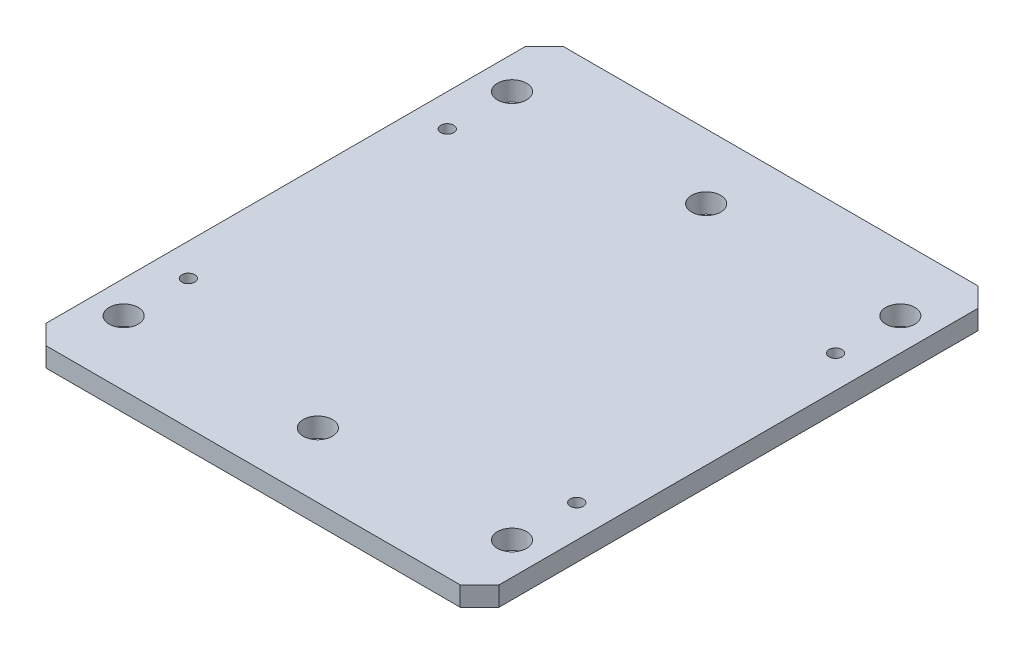
ISO-10303-21;
HEADER;
FILE_DESCRIPTION(('STEP AP214'),'2;1');
FILE_NAME('part.step','',(''),(''),'','','');
FILE_SCHEMA(('AUTOMOTIVE_DESIGN { 1 0 10303 214 1 1 1 1 }'));
ENDSEC;
DATA;
#1=APPLICATION_CONTEXT('core data for automotive mechanical design processes');
#2=APPLICATION_PROTOCOL_DEFINITION('international standard','automotive_design',2000,#1);
#3=PRODUCT_CONTEXT('',#1,'mechanical');
#4=PRODUCT('Part','Part','',(#3));
#5=PRODUCT_RELATED_PRODUCT_CATEGORY('part','',(#4));
#6=PRODUCT_DEFINITION_FORMATION('','',#4);
#7=PRODUCT_DEFINITION_CONTEXT('part definition',#1,'design');
#8=PRODUCT_DEFINITION('design','',#6,#7);
#9=PRODUCT_DEFINITION_SHAPE('','',#8);
#10=(LENGTH_UNIT() NAMED_UNIT(*) SI_UNIT(.MILLI.,.METRE.));
#11=(NAMED_UNIT(*) PLANE_ANGLE_UNIT() SI_UNIT($,.RADIAN.));
#12=(NAMED_UNIT(*) SI_UNIT($,.STERADIAN.) SOLID_ANGLE_UNIT());
#13=UNCERTAINTY_MEASURE_WITH_UNIT(LENGTH_MEASURE(1.E-05),#10,'distance_accuracy_value','');
#14=(GEOMETRIC_REPRESENTATION_CONTEXT(3) GLOBAL_UNCERTAINTY_ASSIGNED_CONTEXT((#13)) GLOBAL_UNIT_ASSIGNED_CONTEXT((#10,
#11,#12)) REPRESENTATION_CONTEXT('',''));
#15=CARTESIAN_POINT('',(0.,0.,0.));
#16=DIRECTION('',(0.,0.,1.));
#17=DIRECTION('',(1.,0.,0.));
#18=AXIS2_PLACEMENT_3D('',#15,#16,#17);
#19=CARTESIAN_POINT('',(0.,0.,80.));
#20=DIRECTION('',(1.,0.,0.));
#21=DIRECTION('',(0.,0.,-1.));
#22=AXIS2_PLACEMENT_3D('',#19,#20,#21);
#23=PLANE('',#22);
#24=DIRECTION('',(0.,1.,0.));
#25=VECTOR('',#24,1.);
#26=CARTESIAN_POINT('',(0.,0.,77.));
#27=LINE('',#26,#25);
#28=CARTESIAN_POINT('',(0.,0.,77.));
#29=VERTEX_POINT('',#28);
#30=CARTESIAN_POINT('',(0.,3.,77.));
#31=VERTEX_POINT('',#30);
#32=EDGE_CURVE('E137',#29,#31,#27,.T.);
#33=ORIENTED_EDGE('',*,*,#32,.T.);
#34=DIRECTION('',(0.,0.,1.));
#35=VECTOR('',#34,1.);
#36=CARTESIAN_POINT('',(0.,3.,0.));
#37=LINE('',#36,#35);
#38=CARTESIAN_POINT('',(0.,3.,3.));
#39=VERTEX_POINT('',#38);
#40=EDGE_CURVE('E48',#39,#31,#37,.T.);
#41=ORIENTED_EDGE('',*,*,#40,.F.);
#42=DIRECTION('',(0.,-1.,0.));
#43=VECTOR('',#42,1.);
#44=CARTESIAN_POINT('',(0.,0.,3.));
#45=LINE('',#44,#43);
#46=CARTESIAN_POINT('',(0.,0.,3.));
#47=VERTEX_POINT('',#46);
#48=EDGE_CURVE('E135',#39,#47,#45,.T.);
#49=ORIENTED_EDGE('',*,*,#48,.T.);
#50=DIRECTION('',(0.,0.,-1.));
#51=VECTOR('',#50,1.);
#52=CARTESIAN_POINT('',(0.,0.,80.));
#53=LINE('',#52,#51);
#54=EDGE_CURVE('E139',#29,#47,#53,.T.);
#55=ORIENTED_EDGE('',*,*,#54,.F.);
#56=EDGE_LOOP('',(#33,#41,#49,#55));
#57=FACE_BOUND('',#56,.T.);
#58=ADVANCED_FACE('F32',(#57),#23,.F.);
#59=CARTESIAN_POINT('',(0.,0.,80.));
#60=DIRECTION('',(0.,1.,0.));
#61=DIRECTION('',(0.,0.,1.));
#62=AXIS2_PLACEMENT_3D('',#59,#60,#61);
#63=PLANE('',#62);
#64=CARTESIAN_POINT('',(65.,0.,20.));
#65=DIRECTION('',(0.,1.,0.));
#66=DIRECTION('',(0.,0.,-1.));
#67=AXIS2_PLACEMENT_3D('',#64,#65,#66);
#68=CIRCLE('',#67,0.999999999999998);
#69=CARTESIAN_POINT('',(65.,0.,19.));
#70=VERTEX_POINT('',#69);
#71=EDGE_CURVE('E177',#70,#70,#68,.T.);
#72=ORIENTED_EDGE('',*,*,#71,.T.);
#73=EDGE_LOOP('',(#72));
#74=FACE_BOUND('',#73,.T.);
#75=CARTESIAN_POINT('',(65.,0.,60.));
#76=DIRECTION('',(0.,1.,0.));
#77=DIRECTION('',(0.,0.,1.));
#78=AXIS2_PLACEMENT_3D('',#75,#76,#77);
#79=CIRCLE('',#78,0.999999999999998);
#80=CARTESIAN_POINT('',(65.,0.,61.));
#81=VERTEX_POINT('',#80);
#82=EDGE_CURVE('E174',#81,#81,#79,.T.);
#83=ORIENTED_EDGE('',*,*,#82,.T.);
#84=EDGE_LOOP('',(#83));
#85=FACE_BOUND('',#84,.T.);
#86=CARTESIAN_POINT('',(5.,0.,60.));
#87=DIRECTION('',(0.,1.,0.));
#88=DIRECTION('',(0.,0.,-1.));
#89=AXIS2_PLACEMENT_3D('',#86,#87,#88);
#90=CIRCLE('',#89,1.);
#91=CARTESIAN_POINT('',(5.,0.,59.));
#92=VERTEX_POINT('',#91);
#93=EDGE_CURVE('E171',#92,#92,#90,.T.);
#94=ORIENTED_EDGE('',*,*,#93,.T.);
#95=EDGE_LOOP('',(#94));
#96=FACE_BOUND('',#95,.T.);
#97=CARTESIAN_POINT('',(5.,0.,20.));
#98=DIRECTION('',(0.,1.,0.));
#99=DIRECTION('',(0.,0.,1.));
#100=AXIS2_PLACEMENT_3D('',#97,#98,#99);
#101=CIRCLE('',#100,1.);
#102=CARTESIAN_POINT('',(5.,0.,21.));
#103=VERTEX_POINT('',#102);
#104=EDGE_CURVE('E168',#103,#103,#101,.T.);
#105=ORIENTED_EDGE('',*,*,#104,.T.);
#106=EDGE_LOOP('',(#105));
#107=FACE_BOUND('',#106,.T.);
#108=CARTESIAN_POINT('',(35.,0.,70.));
#109=DIRECTION('',(0.,1.,0.));
#110=DIRECTION('',(0.,0.,1.));
#111=AXIS2_PLACEMENT_3D('',#108,#109,#110);
#112=CIRCLE('',#111,2.25);
#113=CARTESIAN_POINT('',(35.,0.,72.25));
#114=VERTEX_POINT('',#113);
#115=EDGE_CURVE('E165',#114,#114,#112,.T.);
#116=ORIENTED_EDGE('',*,*,#115,.T.);
#117=EDGE_LOOP('',(#116));
#118=FACE_BOUND('',#117,.T.);
#119=CARTESIAN_POINT('',(35.,0.,10.));
#120=DIRECTION('',(0.,1.,0.));
#121=DIRECTION('',(0.,0.,1.));
#122=AXIS2_PLACEMENT_3D('',#119,#120,#121);
#123=CIRCLE('',#122,2.25);
#124=CARTESIAN_POINT('',(35.,0.,12.25));
#125=VERTEX_POINT('',#124);
#126=EDGE_CURVE('E162',#125,#125,#123,.T.);
#127=ORIENTED_EDGE('',*,*,#126,.T.);
#128=EDGE_LOOP('',(#127));
#129=FACE_BOUND('',#128,.T.);
#130=CARTESIAN_POINT('',(5.,0.,70.));
#131=DIRECTION('',(0.,1.,0.));
#132=DIRECTION('',(0.,0.,-1.));
#133=AXIS2_PLACEMENT_3D('',#130,#131,#132);
#134=CIRCLE('',#133,2.25);
#135=CARTESIAN_POINT('',(5.,0.,67.75));
#136=VERTEX_POINT('',#135);
#137=EDGE_CURVE('E159',#136,#136,#134,.T.);
#138=ORIENTED_EDGE('',*,*,#137,.T.);
#139=EDGE_LOOP('',(#138));
#140=FACE_BOUND('',#139,.T.);
#141=CARTESIAN_POINT('',(65.,0.,10.));
#142=DIRECTION('',(0.,1.,0.));
#143=DIRECTION('',(0.,0.,-1.));
#144=AXIS2_PLACEMENT_3D('',#141,#142,#143);
#145=CIRCLE('',#144,2.25);
#146=CARTESIAN_POINT('',(65.,0.,7.75000000000001));
#147=VERTEX_POINT('',#146);
#148=EDGE_CURVE('E156',#147,#147,#145,.T.);
#149=ORIENTED_EDGE('',*,*,#148,.T.);
#150=EDGE_LOOP('',(#149));
#151=FACE_BOUND('',#150,.T.);
#152=CARTESIAN_POINT('',(65.,0.,70.));
#153=DIRECTION('',(0.,1.,0.));
#154=DIRECTION('',(0.,0.,1.));
#155=AXIS2_PLACEMENT_3D('',#152,#153,#154);
#156=CIRCLE('',#155,2.25);
#157=CARTESIAN_POINT('',(65.,0.,72.25));
#158=VERTEX_POINT('',#157);
#159=EDGE_CURVE('E153',#158,#158,#156,.T.);
#160=ORIENTED_EDGE('',*,*,#159,.T.);
#161=EDGE_LOOP('',(#160));
#162=FACE_BOUND('',#161,.T.);
#163=CARTESIAN_POINT('',(5.,0.,10.));
#164=DIRECTION('',(0.,1.,0.));
#165=DIRECTION('',(0.,0.,1.));
#166=AXIS2_PLACEMENT_3D('',#163,#164,#165);
#167=CIRCLE('',#166,2.25);
#168=CARTESIAN_POINT('',(5.,0.,12.25));
#169=VERTEX_POINT('',#168);
#170=EDGE_CURVE('E149',#169,#169,#167,.T.);
#171=ORIENTED_EDGE('',*,*,#170,.T.);
#172=EDGE_LOOP('',(#171));
#173=FACE_BOUND('',#172,.T.);
#174=ORIENTED_EDGE('',*,*,#54,.T.);
#175=DIRECTION('',(0.707106781186549,0.,-0.707106781186546));
#176=VECTOR('',#175,1.);
#177=CARTESIAN_POINT('',(0.,0.,3.));
#178=LINE('',#177,#176);
#179=CARTESIAN_POINT('',(3.00000000000002,0.,0.));
#180=VERTEX_POINT('',#179);
#181=EDGE_CURVE('E129',#47,#180,#178,.T.);
#182=ORIENTED_EDGE('',*,*,#181,.T.);
#183=DIRECTION('',(1.,0.,0.));
#184=VECTOR('',#183,1.);
#185=CARTESIAN_POINT('',(0.,0.,0.));
#186=LINE('',#185,#184);
#187=CARTESIAN_POINT('',(67.,0.,0.));
#188=VERTEX_POINT('',#187);
#189=EDGE_CURVE('E146',#180,#188,#186,.T.);
#190=ORIENTED_EDGE('',*,*,#189,.T.);
#191=DIRECTION('',(0.707106781186549,0.,0.707106781186546));
#192=VECTOR('',#191,1.);
#193=CARTESIAN_POINT('',(70.,0.,3.));
#194=LINE('',#193,#192);
#195=CARTESIAN_POINT('',(70.,0.,3.));
#196=VERTEX_POINT('',#195);
#197=EDGE_CURVE('E131',#188,#196,#194,.T.);
#198=ORIENTED_EDGE('',*,*,#197,.T.);
#199=DIRECTION('',(0.,0.,-1.));
#200=VECTOR('',#199,1.);
#201=CARTESIAN_POINT('',(70.,0.,80.));
#202=LINE('',#201,#200);
#203=CARTESIAN_POINT('',(70.,0.,77.));
#204=VERTEX_POINT('',#203);
#205=EDGE_CURVE('E142',#204,#196,#202,.T.);
#206=ORIENTED_EDGE('',*,*,#205,.F.);
#207=DIRECTION('',(0.707106781186546,0.,-0.707106781186549));
#208=VECTOR('',#207,1.);
#209=CARTESIAN_POINT('',(67.,0.,80.));
#210=LINE('',#209,#208);
#211=CARTESIAN_POINT('',(67.,0.,80.));
#212=VERTEX_POINT('',#211);
#213=EDGE_CURVE('E56',#204,#212,#210,.F.);
#214=ORIENTED_EDGE('',*,*,#213,.T.);
#215=DIRECTION('',(1.,0.,0.));
#216=VECTOR('',#215,1.);
#217=CARTESIAN_POINT('',(0.,0.,80.));
#218=LINE('',#217,#216);
#219=CARTESIAN_POINT('',(3.,0.,80.));
#220=VERTEX_POINT('',#219);
#221=EDGE_CURVE('E145',#220,#212,#218,.T.);
#222=ORIENTED_EDGE('',*,*,#221,.F.);
#223=DIRECTION('',(0.707106781186546,0.,0.707106781186549));
#224=VECTOR('',#223,1.);
#225=CARTESIAN_POINT('',(3.,0.,80.));
#226=LINE('',#225,#224);
#227=EDGE_CURVE('E116',#220,#29,#226,.F.);
#228=ORIENTED_EDGE('',*,*,#227,.T.);
#229=EDGE_LOOP('',(#174,#182,#190,#198,#206,#214,#222,#228));
#230=FACE_BOUND('',#229,.T.);
#231=ADVANCED_FACE('F227',(#74,#85,#96,#107,#118,#129,#140,#151,#162,#173,#230),#63,.F.);
#232=CARTESIAN_POINT('',(70.,0.,80.));
#233=DIRECTION('',(-1.,0.,0.));
#234=DIRECTION('',(0.,0.,1.));
#235=AXIS2_PLACEMENT_3D('',#232,#233,#234);
#236=PLANE('',#235);
#237=DIRECTION('',(0.,1.,0.));
#238=VECTOR('',#237,1.);
#239=CARTESIAN_POINT('',(70.,12.,3.));
#240=LINE('',#239,#238);
#241=CARTESIAN_POINT('',(70.,3.,3.));
#242=VERTEX_POINT('',#241);
#243=EDGE_CURVE('E117',#196,#242,#240,.T.);
#244=ORIENTED_EDGE('',*,*,#243,.T.);
#245=DIRECTION('',(0.,0.,1.));
#246=VECTOR('',#245,1.);
#247=CARTESIAN_POINT('',(70.,3.,0.));
#248=LINE('',#247,#246);
#249=CARTESIAN_POINT('',(70.,3.,77.));
#250=VERTEX_POINT('',#249);
#251=EDGE_CURVE('E212',#242,#250,#248,.T.);
#252=ORIENTED_EDGE('',*,*,#251,.T.);
#253=DIRECTION('',(0.,-1.,0.));
#254=VECTOR('',#253,1.);
#255=CARTESIAN_POINT('',(70.,0.,77.));
#256=LINE('',#255,#254);
#257=EDGE_CURVE('E120',#250,#204,#256,.T.);
#258=ORIENTED_EDGE('',*,*,#257,.T.);
#259=ORIENTED_EDGE('',*,*,#205,.T.);
#260=EDGE_LOOP('',(#244,#252,#258,#259));
#261=FACE_BOUND('',#260,.T.);
#262=ADVANCED_FACE('F229',(#261),#236,.F.);
#263=CARTESIAN_POINT('',(0.,0.,80.));
#264=DIRECTION('',(0.,0.,-1.));
#265=DIRECTION('',(-1.,0.,0.));
#266=AXIS2_PLACEMENT_3D('',#263,#264,#265);
#267=PLANE('',#266);
#268=DIRECTION('',(0.,1.,0.));
#269=VECTOR('',#268,1.);
#270=CARTESIAN_POINT('',(67.,0.,80.));
#271=LINE('',#270,#269);
#272=CARTESIAN_POINT('',(67.,3.,80.));
#273=VERTEX_POINT('',#272);
#274=EDGE_CURVE('E11',#212,#273,#271,.T.);
#275=ORIENTED_EDGE('',*,*,#274,.T.);
#276=DIRECTION('',(1.,0.,0.));
#277=VECTOR('',#276,1.);
#278=CARTESIAN_POINT('',(0.,3.,80.));
#279=LINE('',#278,#277);
#280=CARTESIAN_POINT('',(3.,3.,80.));
#281=VERTEX_POINT('',#280);
#282=EDGE_CURVE('E101',#281,#273,#279,.T.);
#283=ORIENTED_EDGE('',*,*,#282,.F.);
#284=DIRECTION('',(0.,-1.,0.));
#285=VECTOR('',#284,1.);
#286=CARTESIAN_POINT('',(3.,0.,80.));
#287=LINE('',#286,#285);
#288=EDGE_CURVE('E41',#281,#220,#287,.T.);
#289=ORIENTED_EDGE('',*,*,#288,.T.);
#290=ORIENTED_EDGE('',*,*,#221,.T.);
#291=EDGE_LOOP('',(#275,#283,#289,#290));
#292=FACE_BOUND('',#291,.T.);
#293=ADVANCED_FACE('F111',(#292),#267,.F.);
#294=CARTESIAN_POINT('',(0.,0.,0.));
#295=DIRECTION('',(0.,0.,-1.));
#296=DIRECTION('',(-1.,0.,0.));
#297=AXIS2_PLACEMENT_3D('',#294,#295,#296);
#298=PLANE('',#297);
#299=DIRECTION('',(1.,0.,0.));
#300=VECTOR('',#299,1.);
#301=CARTESIAN_POINT('',(0.,3.,0.));
#302=LINE('',#301,#300);
#303=CARTESIAN_POINT('',(3.00000000000002,3.,0.));
#304=VERTEX_POINT('',#303);
#305=CARTESIAN_POINT('',(67.,3.,0.));
#306=VERTEX_POINT('',#305);
#307=EDGE_CURVE('E114',#304,#306,#302,.T.);
#308=ORIENTED_EDGE('',*,*,#307,.T.);
#309=DIRECTION('',(0.,-1.,0.));
#310=VECTOR('',#309,1.);
#311=CARTESIAN_POINT('',(67.,0.,0.));
#312=LINE('',#311,#310);
#313=EDGE_CURVE('E127',#306,#188,#312,.T.);
#314=ORIENTED_EDGE('',*,*,#313,.T.);
#315=ORIENTED_EDGE('',*,*,#189,.F.);
#316=DIRECTION('',(0.,1.,0.));
#317=VECTOR('',#316,1.);
#318=CARTESIAN_POINT('',(3.00000000000002,12.,0.));
#319=LINE('',#318,#317);
#320=EDGE_CURVE('E124',#180,#304,#319,.T.);
#321=ORIENTED_EDGE('',*,*,#320,.T.);
#322=EDGE_LOOP('',(#308,#314,#315,#321));
#323=FACE_BOUND('',#322,.T.);
#324=ADVANCED_FACE('F218',(#323),#298,.T.);
#325=CARTESIAN_POINT('',(5.,0.,10.));
#326=DIRECTION('',(0.,1.,0.));
#327=DIRECTION('',(0.,0.,1.));
#328=AXIS2_PLACEMENT_3D('',#325,#326,#327);
#329=CYLINDRICAL_SURFACE('',#328,2.25);
#330=CARTESIAN_POINT('',(5.,3.,10.));
#331=DIRECTION('',(0.,-1.,0.));
#332=DIRECTION('',(0.,0.,-1.));
#333=AXIS2_PLACEMENT_3D('',#330,#331,#332);
#334=CIRCLE('',#333,2.25);
#335=CARTESIAN_POINT('',(5.,3.,7.75));
#336=VERTEX_POINT('',#335);
#337=EDGE_CURVE('E180',#336,#336,#334,.F.);
#338=ORIENTED_EDGE('',*,*,#337,.T.);
#339=EDGE_LOOP('',(#338));
#340=FACE_BOUND('',#339,.T.);
#341=ORIENTED_EDGE('',*,*,#170,.F.);
#342=EDGE_LOOP('',(#341));
#343=FACE_BOUND('',#342,.T.);
#344=ADVANCED_FACE('F285',(#340,#343),#329,.F.);
#345=CARTESIAN_POINT('',(65.,0.,70.));
#346=DIRECTION('',(0.,1.,0.));
#347=DIRECTION('',(0.,0.,1.));
#348=AXIS2_PLACEMENT_3D('',#345,#346,#347);
#349=CYLINDRICAL_SURFACE('',#348,2.25);
#350=CARTESIAN_POINT('',(65.,3.,70.));
#351=DIRECTION('',(0.,-1.,0.));
#352=DIRECTION('',(0.,0.,-1.));
#353=AXIS2_PLACEMENT_3D('',#350,#351,#352);
#354=CIRCLE('',#353,2.25);
#355=CARTESIAN_POINT('',(65.,3.,67.75));
#356=VERTEX_POINT('',#355);
#357=EDGE_CURVE('E183',#356,#356,#354,.F.);
#358=ORIENTED_EDGE('',*,*,#357,.T.);
#359=EDGE_LOOP('',(#358));
#360=FACE_BOUND('',#359,.T.);
#361=ORIENTED_EDGE('',*,*,#159,.F.);
#362=EDGE_LOOP('',(#361));
#363=FACE_BOUND('',#362,.T.);
#364=ADVANCED_FACE('F281',(#360,#363),#349,.F.);
#365=CARTESIAN_POINT('',(65.,0.,10.));
#366=DIRECTION('',(0.,1.,0.));
#367=DIRECTION('',(0.,0.,1.));
#368=AXIS2_PLACEMENT_3D('',#365,#366,#367);
#369=CYLINDRICAL_SURFACE('',#368,2.25);
#370=CARTESIAN_POINT('',(65.,3.,10.));
#371=DIRECTION('',(0.,-1.,0.));
#372=DIRECTION('',(0.,0.,-1.));
#373=AXIS2_PLACEMENT_3D('',#370,#371,#372);
#374=CIRCLE('',#373,2.25);
#375=CARTESIAN_POINT('',(65.,3.,7.75000000000001));
#376=VERTEX_POINT('',#375);
#377=EDGE_CURVE('E186',#376,#376,#374,.F.);
#378=ORIENTED_EDGE('',*,*,#377,.T.);
#379=EDGE_LOOP('',(#378));
#380=FACE_BOUND('',#379,.T.);
#381=ORIENTED_EDGE('',*,*,#148,.F.);
#382=EDGE_LOOP('',(#381));
#383=FACE_BOUND('',#382,.T.);
#384=ADVANCED_FACE('F277',(#380,#383),#369,.F.);
#385=CARTESIAN_POINT('',(5.,0.,70.));
#386=DIRECTION('',(0.,1.,0.));
#387=DIRECTION('',(0.,0.,1.));
#388=AXIS2_PLACEMENT_3D('',#385,#386,#387);
#389=CYLINDRICAL_SURFACE('',#388,2.25);
#390=CARTESIAN_POINT('',(5.,3.,70.));
#391=DIRECTION('',(0.,-1.,0.));
#392=DIRECTION('',(0.,0.,-1.));
#393=AXIS2_PLACEMENT_3D('',#390,#391,#392);
#394=CIRCLE('',#393,2.25);
#395=CARTESIAN_POINT('',(5.,3.,67.75));
#396=VERTEX_POINT('',#395);
#397=EDGE_CURVE('E189',#396,#396,#394,.F.);
#398=ORIENTED_EDGE('',*,*,#397,.T.);
#399=EDGE_LOOP('',(#398));
#400=FACE_BOUND('',#399,.T.);
#401=ORIENTED_EDGE('',*,*,#137,.F.);
#402=EDGE_LOOP('',(#401));
#403=FACE_BOUND('',#402,.T.);
#404=ADVANCED_FACE('F268',(#400,#403),#389,.F.);
#405=CARTESIAN_POINT('',(35.,0.,10.));
#406=DIRECTION('',(0.,1.,0.));
#407=DIRECTION('',(0.,0.,1.));
#408=AXIS2_PLACEMENT_3D('',#405,#406,#407);
#409=CYLINDRICAL_SURFACE('',#408,2.25);
#410=CARTESIAN_POINT('',(35.,3.,10.));
#411=DIRECTION('',(0.,-1.,0.));
#412=DIRECTION('',(0.,0.,-1.));
#413=AXIS2_PLACEMENT_3D('',#410,#411,#412);
#414=CIRCLE('',#413,2.25);
#415=CARTESIAN_POINT('',(35.,3.,7.75));
#416=VERTEX_POINT('',#415);
#417=EDGE_CURVE('E192',#416,#416,#414,.F.);
#418=ORIENTED_EDGE('',*,*,#417,.T.);
#419=EDGE_LOOP('',(#418));
#420=FACE_BOUND('',#419,.T.);
#421=ORIENTED_EDGE('',*,*,#126,.F.);
#422=EDGE_LOOP('',(#421));
#423=FACE_BOUND('',#422,.T.);
#424=ADVANCED_FACE('F259',(#420,#423),#409,.F.);
#425=CARTESIAN_POINT('',(35.,0.,70.));
#426=DIRECTION('',(0.,1.,0.));
#427=DIRECTION('',(0.,0.,1.));
#428=AXIS2_PLACEMENT_3D('',#425,#426,#427);
#429=CYLINDRICAL_SURFACE('',#428,2.25);
#430=CARTESIAN_POINT('',(35.,3.,70.));
#431=DIRECTION('',(0.,-1.,0.));
#432=DIRECTION('',(0.,0.,-1.));
#433=AXIS2_PLACEMENT_3D('',#430,#431,#432);
#434=CIRCLE('',#433,2.25);
#435=CARTESIAN_POINT('',(35.,3.,67.75));
#436=VERTEX_POINT('',#435);
#437=EDGE_CURVE('E195',#436,#436,#434,.F.);
#438=ORIENTED_EDGE('',*,*,#437,.T.);
#439=EDGE_LOOP('',(#438));
#440=FACE_BOUND('',#439,.T.);
#441=ORIENTED_EDGE('',*,*,#115,.F.);
#442=EDGE_LOOP('',(#441));
#443=FACE_BOUND('',#442,.T.);
#444=ADVANCED_FACE('F254',(#440,#443),#429,.F.);
#445=CARTESIAN_POINT('',(0.,0.,3.));
#446=DIRECTION('',(-0.707106781186546,0.,-0.707106781186549));
#447=DIRECTION('',(0.,1.,0.));
#448=AXIS2_PLACEMENT_3D('',#445,#446,#447);
#449=PLANE('',#448);
#450=DIRECTION('',(-0.707106781186549,0.,0.707106781186546));
#451=VECTOR('',#450,1.);
#452=CARTESIAN_POINT('',(0.,3.,3.));
#453=LINE('',#452,#451);
#454=EDGE_CURVE('E198',#304,#39,#453,.T.);
#455=ORIENTED_EDGE('',*,*,#454,.F.);
#456=ORIENTED_EDGE('',*,*,#320,.F.);
#457=ORIENTED_EDGE('',*,*,#181,.F.);
#458=ORIENTED_EDGE('',*,*,#48,.F.);
#459=EDGE_LOOP('',(#455,#456,#457,#458));
#460=FACE_BOUND('',#459,.T.);
#461=ADVANCED_FACE('F239',(#460),#449,.T.);
#462=CARTESIAN_POINT('',(70.,0.,3.));
#463=DIRECTION('',(0.707106781186546,0.,-0.707106781186549));
#464=DIRECTION('',(0.,-1.,0.));
#465=AXIS2_PLACEMENT_3D('',#462,#463,#464);
#466=PLANE('',#465);
#467=DIRECTION('',(-0.707106781186549,0.,-0.707106781186546));
#468=VECTOR('',#467,1.);
#469=CARTESIAN_POINT('',(70.,3.,3.));
#470=LINE('',#469,#468);
#471=EDGE_CURVE('E200',#242,#306,#470,.T.);
#472=ORIENTED_EDGE('',*,*,#471,.F.);
#473=ORIENTED_EDGE('',*,*,#243,.F.);
#474=ORIENTED_EDGE('',*,*,#197,.F.);
#475=ORIENTED_EDGE('',*,*,#313,.F.);
#476=EDGE_LOOP('',(#472,#473,#474,#475));
#477=FACE_BOUND('',#476,.T.);
#478=ADVANCED_FACE('F225',(#477),#466,.T.);
#479=CARTESIAN_POINT('',(67.,0.,80.));
#480=DIRECTION('',(-0.707106781186549,0.,-0.707106781186546));
#481=DIRECTION('',(0.,1.,0.));
#482=AXIS2_PLACEMENT_3D('',#479,#480,#481);
#483=PLANE('',#482);
#484=DIRECTION('',(-0.707106781186546,0.,0.707106781186549));
#485=VECTOR('',#484,1.);
#486=CARTESIAN_POINT('',(67.,3.,80.));
#487=LINE('',#486,#485);
#488=EDGE_CURVE('E107',#273,#250,#487,.F.);
#489=ORIENTED_EDGE('',*,*,#488,.F.);
#490=ORIENTED_EDGE('',*,*,#274,.F.);
#491=ORIENTED_EDGE('',*,*,#213,.F.);
#492=ORIENTED_EDGE('',*,*,#257,.F.);
#493=EDGE_LOOP('',(#489,#490,#491,#492));
#494=FACE_BOUND('',#493,.T.);
#495=ADVANCED_FACE('F232',(#494),#483,.F.);
#496=CARTESIAN_POINT('',(3.,0.,80.));
#497=DIRECTION('',(0.707106781186549,0.,-0.707106781186546));
#498=DIRECTION('',(0.,-1.,0.));
#499=AXIS2_PLACEMENT_3D('',#496,#497,#498);
#500=PLANE('',#499);
#501=DIRECTION('',(-0.707106781186546,0.,-0.707106781186549));
#502=VECTOR('',#501,1.);
#503=CARTESIAN_POINT('',(3.,3.,80.));
#504=LINE('',#503,#502);
#505=EDGE_CURVE('E97',#31,#281,#504,.F.);
#506=ORIENTED_EDGE('',*,*,#505,.F.);
#507=ORIENTED_EDGE('',*,*,#32,.F.);
#508=ORIENTED_EDGE('',*,*,#227,.F.);
#509=ORIENTED_EDGE('',*,*,#288,.F.);
#510=EDGE_LOOP('',(#506,#507,#508,#509));
#511=FACE_BOUND('',#510,.T.);
#512=ADVANCED_FACE('F34',(#511),#500,.F.);
#513=CARTESIAN_POINT('',(5.,0.,20.));
#514=DIRECTION('',(0.,1.,0.));
#515=DIRECTION('',(0.,0.,1.));
#516=AXIS2_PLACEMENT_3D('',#513,#514,#515);
#517=CYLINDRICAL_SURFACE('',#516,1.);
#518=CARTESIAN_POINT('',(5.,3.,20.));
#519=DIRECTION('',(0.,-1.,0.));
#520=DIRECTION('',(0.,0.,-1.));
#521=AXIS2_PLACEMENT_3D('',#518,#519,#520);
#522=CIRCLE('',#521,1.);
#523=CARTESIAN_POINT('',(5.,3.,19.));
#524=VERTEX_POINT('',#523);
#525=EDGE_CURVE('E108',#524,#524,#522,.F.);
#526=ORIENTED_EDGE('',*,*,#525,.T.);
#527=EDGE_LOOP('',(#526));
#528=FACE_BOUND('',#527,.T.);
#529=ORIENTED_EDGE('',*,*,#104,.F.);
#530=EDGE_LOOP('',(#529));
#531=FACE_BOUND('',#530,.T.);
#532=ADVANCED_FACE('F238',(#528,#531),#517,.F.);
#533=CARTESIAN_POINT('',(5.,0.,60.));
#534=DIRECTION('',(0.,1.,0.));
#535=DIRECTION('',(0.,0.,1.));
#536=AXIS2_PLACEMENT_3D('',#533,#534,#535);
#537=CYLINDRICAL_SURFACE('',#536,1.);
#538=CARTESIAN_POINT('',(5.,3.,60.));
#539=DIRECTION('',(0.,-1.,0.));
#540=DIRECTION('',(0.,0.,-1.));
#541=AXIS2_PLACEMENT_3D('',#538,#539,#540);
#542=CIRCLE('',#541,1.);
#543=CARTESIAN_POINT('',(5.,3.,59.));
#544=VERTEX_POINT('',#543);
#545=EDGE_CURVE('E205',#544,#544,#542,.F.);
#546=ORIENTED_EDGE('',*,*,#545,.T.);
#547=EDGE_LOOP('',(#546));
#548=FACE_BOUND('',#547,.T.);
#549=ORIENTED_EDGE('',*,*,#93,.F.);
#550=EDGE_LOOP('',(#549));
#551=FACE_BOUND('',#550,.T.);
#552=ADVANCED_FACE('F357',(#548,#551),#537,.F.);
#553=CARTESIAN_POINT('',(65.,0.,60.));
#554=DIRECTION('',(0.,1.,0.));
#555=DIRECTION('',(0.,0.,1.));
#556=AXIS2_PLACEMENT_3D('',#553,#554,#555);
#557=CYLINDRICAL_SURFACE('',#556,0.999999999999998);
#558=CARTESIAN_POINT('',(65.,3.,60.));
#559=DIRECTION('',(0.,-1.,0.));
#560=DIRECTION('',(0.,0.,-1.));
#561=AXIS2_PLACEMENT_3D('',#558,#559,#560);
#562=CIRCLE('',#561,0.999999999999998);
#563=CARTESIAN_POINT('',(65.,3.,59.));
#564=VERTEX_POINT('',#563);
#565=EDGE_CURVE('E208',#564,#564,#562,.F.);
#566=ORIENTED_EDGE('',*,*,#565,.T.);
#567=EDGE_LOOP('',(#566));
#568=FACE_BOUND('',#567,.T.);
#569=ORIENTED_EDGE('',*,*,#82,.F.);
#570=EDGE_LOOP('',(#569));
#571=FACE_BOUND('',#570,.T.);
#572=ADVANCED_FACE('F366',(#568,#571),#557,.F.);
#573=CARTESIAN_POINT('',(65.,0.,20.));
#574=DIRECTION('',(0.,1.,0.));
#575=DIRECTION('',(0.,0.,1.));
#576=AXIS2_PLACEMENT_3D('',#573,#574,#575);
#577=CYLINDRICAL_SURFACE('',#576,0.999999999999998);
#578=CARTESIAN_POINT('',(65.,3.,20.));
#579=DIRECTION('',(0.,-1.,0.));
#580=DIRECTION('',(0.,0.,-1.));
#581=AXIS2_PLACEMENT_3D('',#578,#579,#580);
#582=CIRCLE('',#581,0.999999999999998);
#583=CARTESIAN_POINT('',(65.,3.,19.));
#584=VERTEX_POINT('',#583);
#585=EDGE_CURVE('E36',#584,#584,#582,.F.);
#586=ORIENTED_EDGE('',*,*,#585,.T.);
#587=EDGE_LOOP('',(#586));
#588=FACE_BOUND('',#587,.T.);
#589=ORIENTED_EDGE('',*,*,#71,.F.);
#590=EDGE_LOOP('',(#589));
#591=FACE_BOUND('',#590,.T.);
#592=ADVANCED_FACE('F375',(#588,#591),#577,.F.);
#593=CARTESIAN_POINT('',(0.,3.,0.));
#594=DIRECTION('',(0.,-1.,0.));
#595=DIRECTION('',(0.,0.,-1.));
#596=AXIS2_PLACEMENT_3D('',#593,#594,#595);
#597=PLANE('',#596);
#598=ORIENTED_EDGE('',*,*,#357,.F.);
#599=EDGE_LOOP('',(#598));
#600=FACE_BOUND('',#599,.T.);
#601=ORIENTED_EDGE('',*,*,#397,.F.);
#602=EDGE_LOOP('',(#601));
#603=FACE_BOUND('',#602,.T.);
#604=ORIENTED_EDGE('',*,*,#437,.F.);
#605=EDGE_LOOP('',(#604));
#606=FACE_BOUND('',#605,.T.);
#607=ORIENTED_EDGE('',*,*,#454,.T.);
#608=ORIENTED_EDGE('',*,*,#40,.T.);
#609=ORIENTED_EDGE('',*,*,#505,.T.);
#610=ORIENTED_EDGE('',*,*,#282,.T.);
#611=ORIENTED_EDGE('',*,*,#488,.T.);
#612=ORIENTED_EDGE('',*,*,#251,.F.);
#613=ORIENTED_EDGE('',*,*,#471,.T.);
#614=ORIENTED_EDGE('',*,*,#307,.F.);
#615=EDGE_LOOP('',(#607,#608,#609,#610,#611,#612,#613,#614));
#616=FACE_BOUND('',#615,.T.);
#617=ORIENTED_EDGE('',*,*,#545,.F.);
#618=EDGE_LOOP('',(#617));
#619=FACE_BOUND('',#618,.T.);
#620=ORIENTED_EDGE('',*,*,#585,.F.);
#621=EDGE_LOOP('',(#620));
#622=FACE_BOUND('',#621,.T.);
#623=ORIENTED_EDGE('',*,*,#565,.F.);
#624=EDGE_LOOP('',(#623));
#625=FACE_BOUND('',#624,.T.);
#626=ORIENTED_EDGE('',*,*,#525,.F.);
#627=EDGE_LOOP('',(#626));
#628=FACE_BOUND('',#627,.T.);
#629=ORIENTED_EDGE('',*,*,#417,.F.);
#630=EDGE_LOOP('',(#629));
#631=FACE_BOUND('',#630,.T.);
#632=ORIENTED_EDGE('',*,*,#377,.F.);
#633=EDGE_LOOP('',(#632));
#634=FACE_BOUND('',#633,.T.);
#635=ORIENTED_EDGE('',*,*,#337,.F.);
#636=EDGE_LOOP('',(#635));
#637=FACE_BOUND('',#636,.T.);
#638=ADVANCED_FACE('F99',(#600,#603,#606,#616,#619,#622,#625,#628,#631,#634,#637),#597,.F.);
#639=CLOSED_SHELL('',(#58,#231,#262,#293,#324,#344,#364,#384,#404,#424,#444,#461,#478,#495,#512,
#532,#552,#572,#592,#638));
#640=MANIFOLD_SOLID_BREP('B2',#639);
#641=ADVANCED_BREP_SHAPE_REPRESENTATION('',(#18,#640),#14);
#642=SHAPE_DEFINITION_REPRESENTATION(#9,#641);
ENDSEC;
END-ISO-10303-21;
